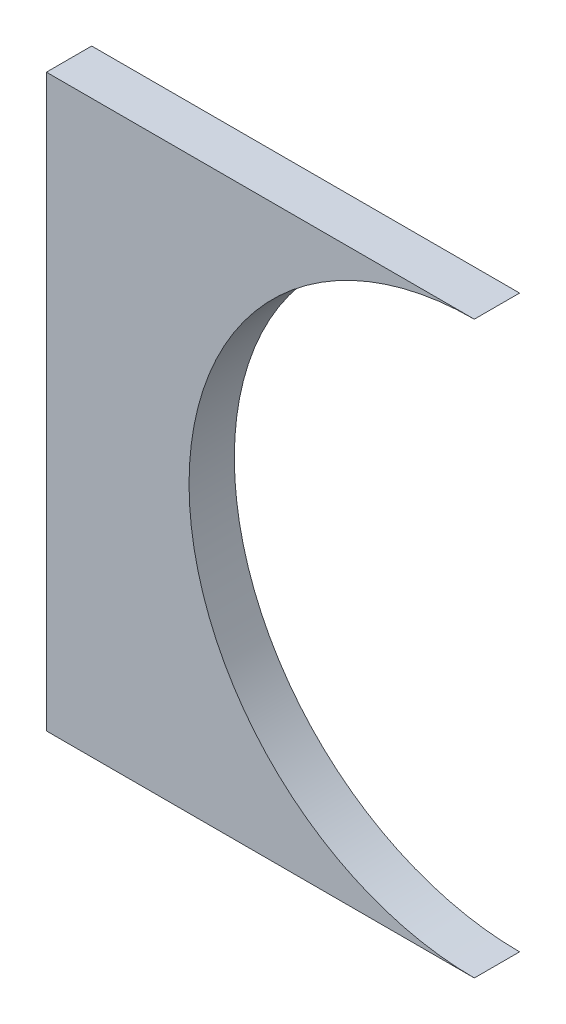
ISO-10303-21;
HEADER;
FILE_DESCRIPTION(('STEP AP214'),'2;1');
FILE_NAME('part.step','',(''),(''),'','','');
FILE_SCHEMA(('AUTOMOTIVE_DESIGN { 1 0 10303 214 1 1 1 1 }'));
ENDSEC;
DATA;
#1=APPLICATION_CONTEXT('core data for automotive mechanical design processes');
#2=APPLICATION_PROTOCOL_DEFINITION('international standard','automotive_design',2000,#1);
#3=PRODUCT_CONTEXT('',#1,'mechanical');
#4=PRODUCT('Part','Part','',(#3));
#5=PRODUCT_RELATED_PRODUCT_CATEGORY('part','',(#4));
#6=PRODUCT_DEFINITION_FORMATION('','',#4);
#7=PRODUCT_DEFINITION_CONTEXT('part definition',#1,'design');
#8=PRODUCT_DEFINITION('design','',#6,#7);
#9=PRODUCT_DEFINITION_SHAPE('','',#8);
#10=(LENGTH_UNIT() NAMED_UNIT(*) SI_UNIT(.MILLI.,.METRE.));
#11=(NAMED_UNIT(*) PLANE_ANGLE_UNIT() SI_UNIT($,.RADIAN.));
#12=(NAMED_UNIT(*) SI_UNIT($,.STERADIAN.) SOLID_ANGLE_UNIT());
#13=UNCERTAINTY_MEASURE_WITH_UNIT(LENGTH_MEASURE(1.E-05),#10,'distance_accuracy_value','');
#14=(GEOMETRIC_REPRESENTATION_CONTEXT(3) GLOBAL_UNCERTAINTY_ASSIGNED_CONTEXT((#13)) GLOBAL_UNIT_ASSIGNED_CONTEXT((#10,
#11,#12)) REPRESENTATION_CONTEXT('',''));
#15=CARTESIAN_POINT('',(0.,0.,0.));
#16=DIRECTION('',(0.,0.,1.));
#17=DIRECTION('',(1.,0.,0.));
#18=AXIS2_PLACEMENT_3D('',#15,#16,#17);
#19=CARTESIAN_POINT('',(0.,0.,3.175));
#20=DIRECTION('',(1.,0.,0.));
#21=DIRECTION('',(0.,0.,-1.));
#22=AXIS2_PLACEMENT_3D('',#19,#20,#21);
#23=PLANE('',#22);
#24=DIRECTION('',(0.,-1.,0.));
#25=VECTOR('',#24,1.);
#26=CARTESIAN_POINT('',(0.,0.,0.));
#27=LINE('',#26,#25);
#28=CARTESIAN_POINT('',(0.,40.,0.));
#29=VERTEX_POINT('',#28);
#30=CARTESIAN_POINT('',(0.,0.,0.));
#31=VERTEX_POINT('',#30);
#32=EDGE_CURVE('E96',#29,#31,#27,.T.);
#33=ORIENTED_EDGE('',*,*,#32,.T.);
#34=DIRECTION('',(0.,0.,-1.));
#35=VECTOR('',#34,1.);
#36=CARTESIAN_POINT('',(0.,0.,3.175));
#37=LINE('',#36,#35);
#38=CARTESIAN_POINT('',(0.,0.,3.175));
#39=VERTEX_POINT('',#38);
#40=EDGE_CURVE('E11',#39,#31,#37,.T.);
#41=ORIENTED_EDGE('',*,*,#40,.F.);
#42=DIRECTION('',(0.,-1.,0.));
#43=VECTOR('',#42,1.);
#44=CARTESIAN_POINT('',(0.,0.,3.175));
#45=LINE('',#44,#43);
#46=CARTESIAN_POINT('',(0.,40.,3.175));
#47=VERTEX_POINT('',#46);
#48=EDGE_CURVE('E84',#47,#39,#45,.T.);
#49=ORIENTED_EDGE('',*,*,#48,.F.);
#50=DIRECTION('',(0.,0.,-1.));
#51=VECTOR('',#50,1.);
#52=CARTESIAN_POINT('',(0.,40.,3.175));
#53=LINE('',#52,#51);
#54=EDGE_CURVE('E92',#47,#29,#53,.T.);
#55=ORIENTED_EDGE('',*,*,#54,.T.);
#56=EDGE_LOOP('',(#33,#41,#49,#55));
#57=FACE_BOUND('',#56,.T.);
#58=ADVANCED_FACE('F33',(#57),#23,.F.);
#59=CARTESIAN_POINT('',(0.,0.,3.175));
#60=DIRECTION('',(0.,1.,0.));
#61=DIRECTION('',(0.,0.,1.));
#62=AXIS2_PLACEMENT_3D('',#59,#60,#61);
#63=PLANE('',#62);
#64=DIRECTION('',(1.,0.,0.));
#65=VECTOR('',#64,1.);
#66=CARTESIAN_POINT('',(0.,0.,0.));
#67=LINE('',#66,#65);
#68=CARTESIAN_POINT('',(30.,0.,0.));
#69=VERTEX_POINT('',#68);
#70=EDGE_CURVE('E88',#31,#69,#67,.T.);
#71=ORIENTED_EDGE('',*,*,#70,.T.);
#72=DIRECTION('',(0.,0.,-1.));
#73=VECTOR('',#72,1.);
#74=CARTESIAN_POINT('',(30.,0.,3.175));
#75=LINE('',#74,#73);
#76=CARTESIAN_POINT('',(30.,0.,3.175));
#77=VERTEX_POINT('',#76);
#78=EDGE_CURVE('E41',#77,#69,#75,.T.);
#79=ORIENTED_EDGE('',*,*,#78,.F.);
#80=DIRECTION('',(1.,0.,0.));
#81=VECTOR('',#80,1.);
#82=CARTESIAN_POINT('',(0.,0.,3.175));
#83=LINE('',#82,#81);
#84=EDGE_CURVE('E79',#39,#77,#83,.T.);
#85=ORIENTED_EDGE('',*,*,#84,.F.);
#86=ORIENTED_EDGE('',*,*,#40,.T.);
#87=EDGE_LOOP('',(#71,#79,#85,#86));
#88=FACE_BOUND('',#87,.T.);
#89=ADVANCED_FACE('F87',(#88),#63,.F.);
#90=CARTESIAN_POINT('',(30.,20.,3.175));
#91=DIRECTION('',(0.,0.,-1.));
#92=DIRECTION('',(-1.,0.,0.));
#93=AXIS2_PLACEMENT_3D('',#90,#91,#92);
#94=CYLINDRICAL_SURFACE('',#93,20.);
#95=CARTESIAN_POINT('',(30.,20.,0.));
#96=DIRECTION('',(0.,0.,-1.));
#97=DIRECTION('',(1.,0.,0.));
#98=AXIS2_PLACEMENT_3D('',#95,#96,#97);
#99=CIRCLE('',#98,20.);
#100=CARTESIAN_POINT('',(30.,40.,0.));
#101=VERTEX_POINT('',#100);
#102=EDGE_CURVE('E66',#69,#101,#99,.T.);
#103=ORIENTED_EDGE('',*,*,#102,.T.);
#104=DIRECTION('',(0.,0.,-1.));
#105=VECTOR('',#104,1.);
#106=CARTESIAN_POINT('',(30.,40.,3.175));
#107=LINE('',#106,#105);
#108=CARTESIAN_POINT('',(30.,40.,3.175));
#109=VERTEX_POINT('',#108);
#110=EDGE_CURVE('E89',#109,#101,#107,.T.);
#111=ORIENTED_EDGE('',*,*,#110,.F.);
#112=CARTESIAN_POINT('',(30.,20.,3.175));
#113=DIRECTION('',(0.,0.,-1.));
#114=DIRECTION('',(1.,0.,0.));
#115=AXIS2_PLACEMENT_3D('',#112,#113,#114);
#116=CIRCLE('',#115,20.);
#117=EDGE_CURVE('E82',#77,#109,#116,.T.);
#118=ORIENTED_EDGE('',*,*,#117,.F.);
#119=ORIENTED_EDGE('',*,*,#78,.T.);
#120=EDGE_LOOP('',(#103,#111,#118,#119));
#121=FACE_BOUND('',#120,.T.);
#122=ADVANCED_FACE('F90',(#121),#94,.F.);
#123=CARTESIAN_POINT('',(0.,40.,3.175));
#124=DIRECTION('',(0.,-1.,0.));
#125=DIRECTION('',(0.,0.,-1.));
#126=AXIS2_PLACEMENT_3D('',#123,#124,#125);
#127=PLANE('',#126);
#128=DIRECTION('',(-1.,0.,0.));
#129=VECTOR('',#128,1.);
#130=CARTESIAN_POINT('',(0.,40.,0.));
#131=LINE('',#130,#129);
#132=EDGE_CURVE('E72',#101,#29,#131,.T.);
#133=ORIENTED_EDGE('',*,*,#132,.T.);
#134=ORIENTED_EDGE('',*,*,#54,.F.);
#135=DIRECTION('',(-1.,0.,0.));
#136=VECTOR('',#135,1.);
#137=CARTESIAN_POINT('',(0.,40.,3.175));
#138=LINE('',#137,#136);
#139=EDGE_CURVE('E49',#109,#47,#138,.T.);
#140=ORIENTED_EDGE('',*,*,#139,.F.);
#141=ORIENTED_EDGE('',*,*,#110,.T.);
#142=EDGE_LOOP('',(#133,#134,#140,#141));
#143=FACE_BOUND('',#142,.T.);
#144=ADVANCED_FACE('F103',(#143),#127,.F.);
#145=CARTESIAN_POINT('',(30.,20.,3.175));
#146=DIRECTION('',(0.,0.,1.));
#147=DIRECTION('',(1.,0.,0.));
#148=AXIS2_PLACEMENT_3D('',#145,#146,#147);
#149=PLANE('',#148);
#150=ORIENTED_EDGE('',*,*,#48,.T.);
#151=ORIENTED_EDGE('',*,*,#84,.T.);
#152=ORIENTED_EDGE('',*,*,#117,.T.);
#153=ORIENTED_EDGE('',*,*,#139,.T.);
#154=EDGE_LOOP('',(#150,#151,#152,#153));
#155=FACE_BOUND('',#154,.T.);
#156=ADVANCED_FACE('F80',(#155),#149,.T.);
#157=CARTESIAN_POINT('',(30.,20.,0.));
#158=DIRECTION('',(0.,0.,1.));
#159=DIRECTION('',(1.,0.,0.));
#160=AXIS2_PLACEMENT_3D('',#157,#158,#159);
#161=PLANE('',#160);
#162=ORIENTED_EDGE('',*,*,#32,.F.);
#163=ORIENTED_EDGE('',*,*,#132,.F.);
#164=ORIENTED_EDGE('',*,*,#102,.F.);
#165=ORIENTED_EDGE('',*,*,#70,.F.);
#166=EDGE_LOOP('',(#162,#163,#164,#165));
#167=FACE_BOUND('',#166,.T.);
#168=ADVANCED_FACE('F106',(#167),#161,.F.);
#169=CLOSED_SHELL('',(#58,#89,#122,#144,#156,#168));
#170=MANIFOLD_SOLID_BREP('B2',#169);
#171=ADVANCED_BREP_SHAPE_REPRESENTATION('',(#18,#170),#14);
#172=SHAPE_DEFINITION_REPRESENTATION(#9,#171);
ENDSEC;
END-ISO-10303-21;
